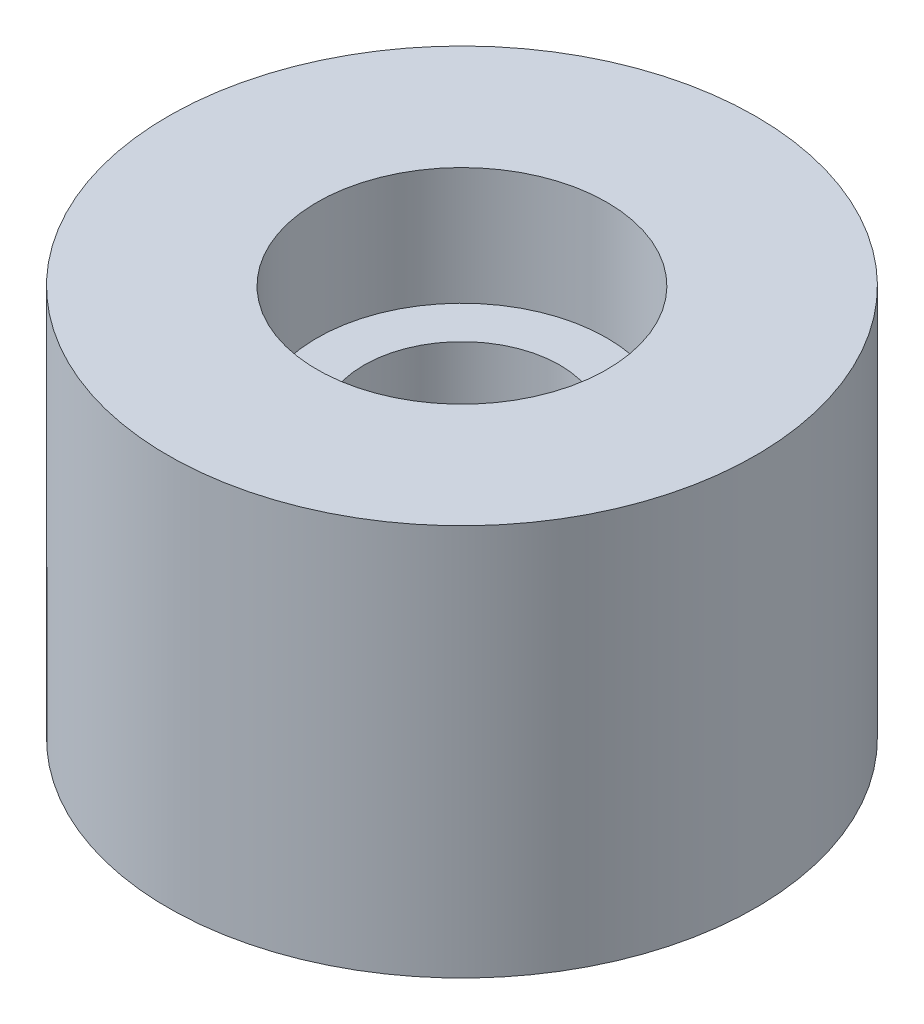
ISO-10303-21;
HEADER;
FILE_DESCRIPTION(('STEP AP214'),'2;1');
FILE_NAME('part.step','',(''),(''),'','','');
FILE_SCHEMA(('AUTOMOTIVE_DESIGN { 1 0 10303 214 1 1 1 1 }'));
ENDSEC;
DATA;
#1=APPLICATION_CONTEXT('core data for automotive mechanical design processes');
#2=APPLICATION_PROTOCOL_DEFINITION('international standard','automotive_design',2000,#1);
#3=PRODUCT_CONTEXT('',#1,'mechanical');
#4=PRODUCT('Part','Part','',(#3));
#5=PRODUCT_RELATED_PRODUCT_CATEGORY('part','',(#4));
#6=PRODUCT_DEFINITION_FORMATION('','',#4);
#7=PRODUCT_DEFINITION_CONTEXT('part definition',#1,'design');
#8=PRODUCT_DEFINITION('design','',#6,#7);
#9=PRODUCT_DEFINITION_SHAPE('','',#8);
#10=(LENGTH_UNIT() NAMED_UNIT(*) SI_UNIT(.MILLI.,.METRE.));
#11=(NAMED_UNIT(*) PLANE_ANGLE_UNIT() SI_UNIT($,.RADIAN.));
#12=(NAMED_UNIT(*) SI_UNIT($,.STERADIAN.) SOLID_ANGLE_UNIT());
#13=UNCERTAINTY_MEASURE_WITH_UNIT(LENGTH_MEASURE(1.E-05),#10,'distance_accuracy_value','');
#14=(GEOMETRIC_REPRESENTATION_CONTEXT(3) GLOBAL_UNCERTAINTY_ASSIGNED_CONTEXT((#13)) GLOBAL_UNIT_ASSIGNED_CONTEXT((#10,
#11,#12)) REPRESENTATION_CONTEXT('',''));
#15=CARTESIAN_POINT('',(0.,0.,0.));
#16=DIRECTION('',(0.,0.,1.));
#17=DIRECTION('',(1.,0.,0.));
#18=AXIS2_PLACEMENT_3D('',#15,#16,#17);
#19=CARTESIAN_POINT('',(0.,-6.62953088122321,0.));
#20=DIRECTION('',(0.,-1.,0.));
#21=DIRECTION('',(0.,0.,-1.));
#22=AXIS2_PLACEMENT_3D('',#19,#20,#21);
#23=CYLINDRICAL_SURFACE('',#22,7.5);
#24=CARTESIAN_POINT('',(0.,0.,0.));
#25=DIRECTION('',(0.,-1.,0.));
#26=DIRECTION('',(0.,0.,-1.));
#27=AXIS2_PLACEMENT_3D('',#24,#25,#26);
#28=CIRCLE('',#27,7.5);
#29=CARTESIAN_POINT('',(0.,0.,-7.5));
#30=VERTEX_POINT('',#29);
#31=EDGE_CURVE('E60',#30,#30,#28,.T.);
#32=ORIENTED_EDGE('',*,*,#31,.F.);
#33=EDGE_LOOP('',(#32));
#34=FACE_BOUND('',#33,.T.);
#35=CARTESIAN_POINT('',(0.,10.,0.));
#36=DIRECTION('',(0.,-1.,0.));
#37=DIRECTION('',(0.,0.,-1.));
#38=AXIS2_PLACEMENT_3D('',#35,#36,#37);
#39=CIRCLE('',#38,7.5);
#40=CARTESIAN_POINT('',(0.,10.,-7.5));
#41=VERTEX_POINT('',#40);
#42=EDGE_CURVE('E10',#41,#41,#39,.T.);
#43=ORIENTED_EDGE('',*,*,#42,.T.);
#44=EDGE_LOOP('',(#43));
#45=FACE_BOUND('',#44,.T.);
#46=ADVANCED_FACE('F32',(#34,#45),#23,.T.);
#47=CARTESIAN_POINT('',(-7.5,10.,0.));
#48=DIRECTION('',(0.,-1.,0.));
#49=DIRECTION('',(0.,0.,-1.));
#50=AXIS2_PLACEMENT_3D('',#47,#48,#49);
#51=PLANE('',#50);
#52=ORIENTED_EDGE('',*,*,#42,.F.);
#53=EDGE_LOOP('',(#52));
#54=FACE_BOUND('',#53,.T.);
#55=CARTESIAN_POINT('',(0.,10.,0.));
#56=DIRECTION('',(0.,-1.,0.));
#57=DIRECTION('',(0.,0.,-1.));
#58=AXIS2_PLACEMENT_3D('',#55,#56,#57);
#59=CIRCLE('',#58,3.7);
#60=CARTESIAN_POINT('',(0.,10.,-3.7));
#61=VERTEX_POINT('',#60);
#62=EDGE_CURVE('E38',#61,#61,#59,.T.);
#63=ORIENTED_EDGE('',*,*,#62,.T.);
#64=EDGE_LOOP('',(#63));
#65=FACE_BOUND('',#64,.T.);
#66=ADVANCED_FACE('F67',(#54,#65),#51,.F.);
#67=CARTESIAN_POINT('',(0.,-6.62953088122321,0.));
#68=DIRECTION('',(0.,-1.,0.));
#69=DIRECTION('',(0.,0.,-1.));
#70=AXIS2_PLACEMENT_3D('',#67,#68,#69);
#71=CYLINDRICAL_SURFACE('',#70,3.7);
#72=ORIENTED_EDGE('',*,*,#62,.F.);
#73=EDGE_LOOP('',(#72));
#74=FACE_BOUND('',#73,.T.);
#75=CARTESIAN_POINT('',(0.,7.,0.));
#76=DIRECTION('',(0.,-1.,0.));
#77=DIRECTION('',(0.,0.,-1.));
#78=AXIS2_PLACEMENT_3D('',#75,#76,#77);
#79=CIRCLE('',#78,3.7);
#80=CARTESIAN_POINT('',(0.,7.,-3.7));
#81=VERTEX_POINT('',#80);
#82=EDGE_CURVE('E42',#81,#81,#79,.T.);
#83=ORIENTED_EDGE('',*,*,#82,.T.);
#84=EDGE_LOOP('',(#83));
#85=FACE_BOUND('',#84,.T.);
#86=ADVANCED_FACE('F71',(#74,#85),#71,.F.);
#87=CARTESIAN_POINT('',(-2.5,7.,0.));
#88=DIRECTION('',(0.,-1.,0.));
#89=DIRECTION('',(0.,0.,-1.));
#90=AXIS2_PLACEMENT_3D('',#87,#88,#89);
#91=PLANE('',#90);
#92=ORIENTED_EDGE('',*,*,#82,.F.);
#93=EDGE_LOOP('',(#92));
#94=FACE_BOUND('',#93,.T.);
#95=CARTESIAN_POINT('',(0.,7.,0.));
#96=DIRECTION('',(0.,-1.,0.));
#97=DIRECTION('',(0.,0.,-1.));
#98=AXIS2_PLACEMENT_3D('',#95,#96,#97);
#99=CIRCLE('',#98,2.5);
#100=CARTESIAN_POINT('',(0.,7.,-2.5));
#101=VERTEX_POINT('',#100);
#102=EDGE_CURVE('E46',#101,#101,#99,.T.);
#103=ORIENTED_EDGE('',*,*,#102,.T.);
#104=EDGE_LOOP('',(#103));
#105=FACE_BOUND('',#104,.T.);
#106=ADVANCED_FACE('F76',(#94,#105),#91,.F.);
#107=CARTESIAN_POINT('',(0.,-6.62953088122321,0.));
#108=DIRECTION('',(0.,-1.,0.));
#109=DIRECTION('',(0.,0.,-1.));
#110=AXIS2_PLACEMENT_3D('',#107,#108,#109);
#111=CYLINDRICAL_SURFACE('',#110,2.5);
#112=ORIENTED_EDGE('',*,*,#102,.F.);
#113=EDGE_LOOP('',(#112));
#114=FACE_BOUND('',#113,.T.);
#115=CARTESIAN_POINT('',(0.,3.,0.));
#116=DIRECTION('',(0.,-1.,0.));
#117=DIRECTION('',(0.,0.,-1.));
#118=AXIS2_PLACEMENT_3D('',#115,#116,#117);
#119=CIRCLE('',#118,2.5);
#120=CARTESIAN_POINT('',(0.,3.,-2.5));
#121=VERTEX_POINT('',#120);
#122=EDGE_CURVE('E51',#121,#121,#119,.T.);
#123=ORIENTED_EDGE('',*,*,#122,.T.);
#124=EDGE_LOOP('',(#123));
#125=FACE_BOUND('',#124,.T.);
#126=ADVANCED_FACE('F82',(#114,#125),#111,.F.);
#127=CARTESIAN_POINT('',(-3.7,3.,0.));
#128=DIRECTION('',(0.,1.,0.));
#129=DIRECTION('',(0.,0.,1.));
#130=AXIS2_PLACEMENT_3D('',#127,#128,#129);
#131=PLANE('',#130);
#132=ORIENTED_EDGE('',*,*,#122,.F.);
#133=EDGE_LOOP('',(#132));
#134=FACE_BOUND('',#133,.T.);
#135=CARTESIAN_POINT('',(0.,3.,0.));
#136=DIRECTION('',(0.,-1.,0.));
#137=DIRECTION('',(0.,0.,-1.));
#138=AXIS2_PLACEMENT_3D('',#135,#136,#137);
#139=CIRCLE('',#138,3.7);
#140=CARTESIAN_POINT('',(0.,3.,-3.7));
#141=VERTEX_POINT('',#140);
#142=EDGE_CURVE('E54',#141,#141,#139,.T.);
#143=ORIENTED_EDGE('',*,*,#142,.T.);
#144=EDGE_LOOP('',(#143));
#145=FACE_BOUND('',#144,.T.);
#146=ADVANCED_FACE('F86',(#134,#145),#131,.F.);
#147=CARTESIAN_POINT('',(0.,-6.62953088122321,0.));
#148=DIRECTION('',(0.,-1.,0.));
#149=DIRECTION('',(0.,0.,-1.));
#150=AXIS2_PLACEMENT_3D('',#147,#148,#149);
#151=CYLINDRICAL_SURFACE('',#150,3.7);
#152=ORIENTED_EDGE('',*,*,#142,.F.);
#153=EDGE_LOOP('',(#152));
#154=FACE_BOUND('',#153,.T.);
#155=CARTESIAN_POINT('',(0.,0.,0.));
#156=DIRECTION('',(0.,-1.,0.));
#157=DIRECTION('',(0.,0.,-1.));
#158=AXIS2_PLACEMENT_3D('',#155,#156,#157);
#159=CIRCLE('',#158,3.7);
#160=CARTESIAN_POINT('',(0.,0.,-3.7));
#161=VERTEX_POINT('',#160);
#162=EDGE_CURVE('E57',#161,#161,#159,.T.);
#163=ORIENTED_EDGE('',*,*,#162,.T.);
#164=EDGE_LOOP('',(#163));
#165=FACE_BOUND('',#164,.T.);
#166=ADVANCED_FACE('F90',(#154,#165),#151,.F.);
#167=CARTESIAN_POINT('',(-3.7,0.,0.));
#168=DIRECTION('',(0.,1.,0.));
#169=DIRECTION('',(0.,0.,1.));
#170=AXIS2_PLACEMENT_3D('',#167,#168,#169);
#171=PLANE('',#170);
#172=ORIENTED_EDGE('',*,*,#162,.F.);
#173=EDGE_LOOP('',(#172));
#174=FACE_BOUND('',#173,.T.);
#175=ORIENTED_EDGE('',*,*,#31,.T.);
#176=EDGE_LOOP('',(#175));
#177=FACE_BOUND('',#176,.T.);
#178=ADVANCED_FACE('F64',(#174,#177),#171,.F.);
#179=CLOSED_SHELL('',(#46,#66,#86,#106,#126,#146,#166,#178));
#180=MANIFOLD_SOLID_BREP('B2',#179);
#181=ADVANCED_BREP_SHAPE_REPRESENTATION('',(#18,#180),#14);
#182=SHAPE_DEFINITION_REPRESENTATION(#9,#181);
ENDSEC;
END-ISO-10303-21;
